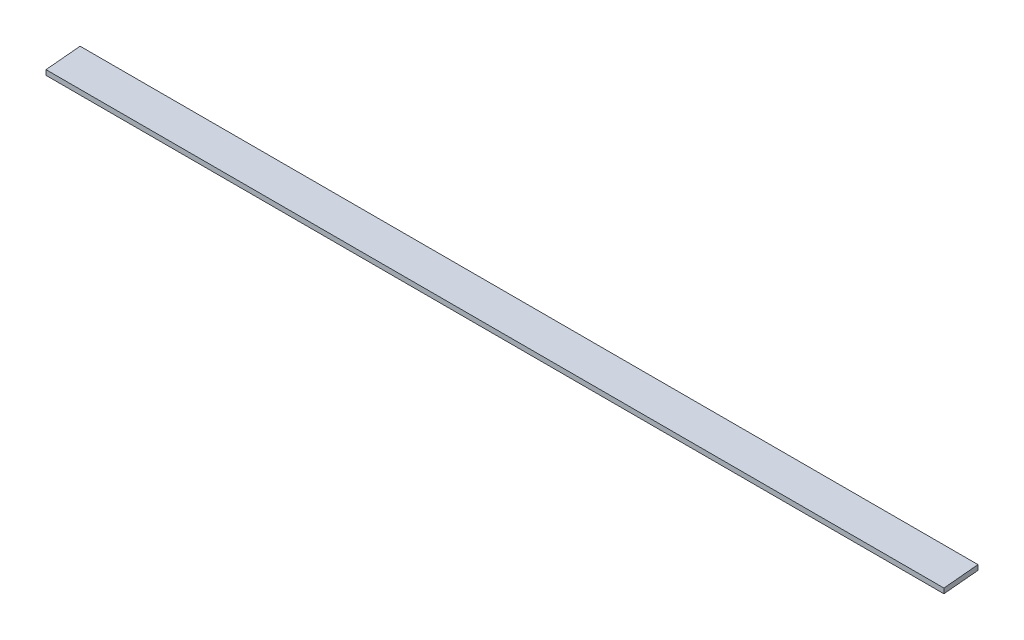
ISO-10303-21;
HEADER;
FILE_DESCRIPTION(('STEP AP214'),'2;1');
FILE_NAME('part.step','',(''),(''),'','','');
FILE_SCHEMA(('AUTOMOTIVE_DESIGN { 1 0 10303 214 1 1 1 1 }'));
ENDSEC;
DATA;
#1=APPLICATION_CONTEXT('core data for automotive mechanical design processes');
#2=APPLICATION_PROTOCOL_DEFINITION('international standard','automotive_design',2000,#1);
#3=PRODUCT_CONTEXT('',#1,'mechanical');
#4=PRODUCT('Part','Part','',(#3));
#5=PRODUCT_RELATED_PRODUCT_CATEGORY('part','',(#4));
#6=PRODUCT_DEFINITION_FORMATION('','',#4);
#7=PRODUCT_DEFINITION_CONTEXT('part definition',#1,'design');
#8=PRODUCT_DEFINITION('design','',#6,#7);
#9=PRODUCT_DEFINITION_SHAPE('','',#8);
#10=(LENGTH_UNIT() NAMED_UNIT(*) SI_UNIT(.MILLI.,.METRE.));
#11=(NAMED_UNIT(*) PLANE_ANGLE_UNIT() SI_UNIT($,.RADIAN.));
#12=(NAMED_UNIT(*) SI_UNIT($,.STERADIAN.) SOLID_ANGLE_UNIT());
#13=UNCERTAINTY_MEASURE_WITH_UNIT(LENGTH_MEASURE(1.E-05),#10,'distance_accuracy_value','');
#14=(GEOMETRIC_REPRESENTATION_CONTEXT(3) GLOBAL_UNCERTAINTY_ASSIGNED_CONTEXT((#13)) GLOBAL_UNIT_ASSIGNED_CONTEXT((#10,
#11,#12)) REPRESENTATION_CONTEXT('',''));
#15=CARTESIAN_POINT('',(0.,0.,0.));
#16=DIRECTION('',(0.,0.,1.));
#17=DIRECTION('',(1.,0.,0.));
#18=AXIS2_PLACEMENT_3D('',#15,#16,#17);
#19=CARTESIAN_POINT('',(-1143.,11.90625,-44.45));
#20=DIRECTION('',(0.,0.,1.));
#21=DIRECTION('',(1.,0.,0.));
#22=AXIS2_PLACEMENT_3D('',#19,#20,#21);
#23=PLANE('',#22);
#24=DIRECTION('',(-1.,0.,0.));
#25=VECTOR('',#24,1.);
#26=CARTESIAN_POINT('',(-1143.,0.,-44.45));
#27=LINE('',#26,#25);
#28=CARTESIAN_POINT('',(1120.14100781255,0.,-44.45));
#29=VERTEX_POINT('',#28);
#30=CARTESIAN_POINT('',(-1017.42774218746,0.,-44.45));
#31=VERTEX_POINT('',#30);
#32=EDGE_CURVE('E87',#29,#31,#27,.T.);
#33=ORIENTED_EDGE('',*,*,#32,.T.);
#34=DIRECTION('',(0.,-1.,0.));
#35=VECTOR('',#34,1.);
#36=CARTESIAN_POINT('',(-1017.42774218746,11.90625,-44.45));
#37=LINE('',#36,#35);
#38=CARTESIAN_POINT('',(-1017.42774218746,11.90625,-44.45));
#39=VERTEX_POINT('',#38);
#40=EDGE_CURVE('E49',#39,#31,#37,.T.);
#41=ORIENTED_EDGE('',*,*,#40,.F.);
#42=DIRECTION('',(-1.,0.,0.));
#43=VECTOR('',#42,1.);
#44=CARTESIAN_POINT('',(-1143.,11.90625,-44.45));
#45=LINE('',#44,#43);
#46=CARTESIAN_POINT('',(1120.14100781255,11.90625,-44.45));
#47=VERTEX_POINT('',#46);
#48=EDGE_CURVE('E41',#47,#39,#45,.T.);
#49=ORIENTED_EDGE('',*,*,#48,.F.);
#50=DIRECTION('',(0.,-1.,0.));
#51=VECTOR('',#50,1.);
#52=CARTESIAN_POINT('',(1120.14100781255,11.90625,-44.45));
#53=LINE('',#52,#51);
#54=EDGE_CURVE('E103',#47,#29,#53,.T.);
#55=ORIENTED_EDGE('',*,*,#54,.T.);
#56=EDGE_LOOP('',(#33,#41,#49,#55));
#57=FACE_BOUND('',#56,.T.);
#58=ADVANCED_FACE('F33',(#57),#23,.F.);
#59=CARTESIAN_POINT('',(-1143.,11.90625,44.45));
#60=DIRECTION('',(0.,0.,-1.));
#61=DIRECTION('',(-1.,0.,0.));
#62=AXIS2_PLACEMENT_3D('',#59,#60,#61);
#63=PLANE('',#62);
#64=DIRECTION('',(1.,0.,0.));
#65=VECTOR('',#64,1.);
#66=CARTESIAN_POINT('',(-1143.,11.90625,44.45));
#67=LINE('',#66,#65);
#68=CARTESIAN_POINT('',(-1009.65,11.90625,44.45));
#69=VERTEX_POINT('',#68);
#70=CARTESIAN_POINT('',(1127.91875,11.90625,44.45));
#71=VERTEX_POINT('',#70);
#72=EDGE_CURVE('E11',#69,#71,#67,.T.);
#73=ORIENTED_EDGE('',*,*,#72,.F.);
#74=DIRECTION('',(0.,-1.,0.));
#75=VECTOR('',#74,1.);
#76=CARTESIAN_POINT('',(-1009.65,11.90625,44.45));
#77=LINE('',#76,#75);
#78=CARTESIAN_POINT('',(-1009.65,0.,44.45));
#79=VERTEX_POINT('',#78);
#80=EDGE_CURVE('E76',#69,#79,#77,.T.);
#81=ORIENTED_EDGE('',*,*,#80,.T.);
#82=DIRECTION('',(1.,0.,0.));
#83=VECTOR('',#82,1.);
#84=CARTESIAN_POINT('',(-1143.,0.,44.45));
#85=LINE('',#84,#83);
#86=CARTESIAN_POINT('',(1127.91875,0.,44.45));
#87=VERTEX_POINT('',#86);
#88=EDGE_CURVE('E36',#79,#87,#85,.T.);
#89=ORIENTED_EDGE('',*,*,#88,.T.);
#90=DIRECTION('',(0.,-1.,0.));
#91=VECTOR('',#90,1.);
#92=CARTESIAN_POINT('',(1127.91875,11.90625,44.45));
#93=LINE('',#92,#91);
#94=EDGE_CURVE('E57',#71,#87,#93,.T.);
#95=ORIENTED_EDGE('',*,*,#94,.F.);
#96=EDGE_LOOP('',(#73,#81,#89,#95));
#97=FACE_BOUND('',#96,.T.);
#98=ADVANCED_FACE('F106',(#97),#63,.F.);
#99=CARTESIAN_POINT('',(0.,11.90625,0.));
#100=DIRECTION('',(0.,-1.,0.));
#101=DIRECTION('',(0.,0.,-1.));
#102=AXIS2_PLACEMENT_3D('',#99,#100,#101);
#103=PLANE('',#102);
#104=ORIENTED_EDGE('',*,*,#48,.T.);
#105=DIRECTION('',(0.0871557427476618,0.,0.996194698091745));
#106=VECTOR('',#105,1.);
#107=CARTESIAN_POINT('',(-1017.42774218746,11.90625,-44.45));
#108=LINE('',#107,#106);
#109=EDGE_CURVE('E73',#39,#69,#108,.T.);
#110=ORIENTED_EDGE('',*,*,#109,.T.);
#111=ORIENTED_EDGE('',*,*,#72,.T.);
#112=DIRECTION('',(-0.0871557427476544,0.,-0.996194698091746));
#113=VECTOR('',#112,1.);
#114=CARTESIAN_POINT('',(1120.14100781255,11.90625,-44.45));
#115=LINE('',#114,#113);
#116=EDGE_CURVE('E91',#71,#47,#115,.T.);
#117=ORIENTED_EDGE('',*,*,#116,.T.);
#118=EDGE_LOOP('',(#104,#110,#111,#117));
#119=FACE_BOUND('',#118,.T.);
#120=ADVANCED_FACE('F90',(#119),#103,.F.);
#121=CARTESIAN_POINT('',(0.,0.,0.));
#122=DIRECTION('',(0.,-1.,0.));
#123=DIRECTION('',(0.,0.,-1.));
#124=AXIS2_PLACEMENT_3D('',#121,#122,#123);
#125=PLANE('',#124);
#126=DIRECTION('',(0.0871557427476618,0.,0.996194698091745));
#127=VECTOR('',#126,1.);
#128=CARTESIAN_POINT('',(-1017.42774218746,0.,-44.45));
#129=LINE('',#128,#127);
#130=EDGE_CURVE('E80',#31,#79,#129,.T.);
#131=ORIENTED_EDGE('',*,*,#130,.F.);
#132=ORIENTED_EDGE('',*,*,#32,.F.);
#133=DIRECTION('',(-0.0871557427476544,0.,-0.996194698091746));
#134=VECTOR('',#133,1.);
#135=CARTESIAN_POINT('',(1120.14100781255,0.,-44.45));
#136=LINE('',#135,#134);
#137=EDGE_CURVE('E102',#87,#29,#136,.T.);
#138=ORIENTED_EDGE('',*,*,#137,.F.);
#139=ORIENTED_EDGE('',*,*,#88,.F.);
#140=EDGE_LOOP('',(#131,#132,#138,#139));
#141=FACE_BOUND('',#140,.T.);
#142=ADVANCED_FACE('F105',(#141),#125,.T.);
#143=CARTESIAN_POINT('',(1120.14100781255,11.90625,-44.45));
#144=DIRECTION('',(-0.996194698091746,0.,0.0871557427476544));
#145=DIRECTION('',(0.0871557427476544,0.,0.996194698091746));
#146=AXIS2_PLACEMENT_3D('',#143,#144,#145);
#147=PLANE('',#146);
#148=ORIENTED_EDGE('',*,*,#137,.T.);
#149=ORIENTED_EDGE('',*,*,#54,.F.);
#150=ORIENTED_EDGE('',*,*,#116,.F.);
#151=ORIENTED_EDGE('',*,*,#94,.T.);
#152=EDGE_LOOP('',(#148,#149,#150,#151));
#153=FACE_BOUND('',#152,.T.);
#154=ADVANCED_FACE('F115',(#153),#147,.F.);
#155=CARTESIAN_POINT('',(-1017.42774218746,11.90625,-44.45));
#156=DIRECTION('',(0.996194698091745,0.,-0.0871557427476618));
#157=DIRECTION('',(-0.0871557427476618,0.,-0.996194698091745));
#158=AXIS2_PLACEMENT_3D('',#155,#156,#157);
#159=PLANE('',#158);
#160=ORIENTED_EDGE('',*,*,#130,.T.);
#161=ORIENTED_EDGE('',*,*,#80,.F.);
#162=ORIENTED_EDGE('',*,*,#109,.F.);
#163=ORIENTED_EDGE('',*,*,#40,.T.);
#164=EDGE_LOOP('',(#160,#161,#162,#163));
#165=FACE_BOUND('',#164,.T.);
#166=ADVANCED_FACE('F74',(#165),#159,.F.);
#167=CLOSED_SHELL('',(#58,#98,#120,#142,#154,#166));
#168=MANIFOLD_SOLID_BREP('B2',#167);
#169=ADVANCED_BREP_SHAPE_REPRESENTATION('',(#18,#168),#14);
#170=SHAPE_DEFINITION_REPRESENTATION(#9,#169);
ENDSEC;
END-ISO-10303-21;
